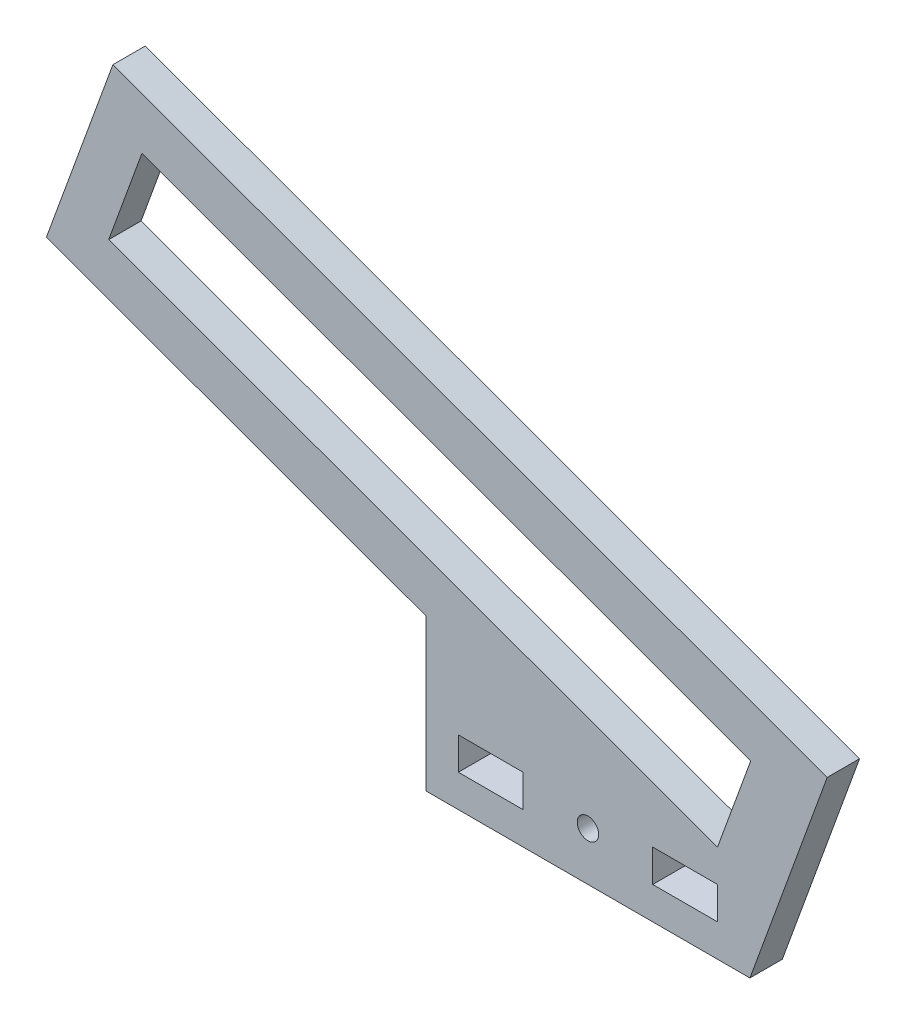
ISO-10303-21;
HEADER;
FILE_DESCRIPTION(('STEP AP214'),'2;1');
FILE_NAME('part.step','',(''),(''),'','','');
FILE_SCHEMA(('AUTOMOTIVE_DESIGN { 1 0 10303 214 1 1 1 1 }'));
ENDSEC;
DATA;
#1=APPLICATION_CONTEXT('core data for automotive mechanical design processes');
#2=APPLICATION_PROTOCOL_DEFINITION('international standard','automotive_design',2000,#1);
#3=PRODUCT_CONTEXT('',#1,'mechanical');
#4=PRODUCT('Part','Part','',(#3));
#5=PRODUCT_RELATED_PRODUCT_CATEGORY('part','',(#4));
#6=PRODUCT_DEFINITION_FORMATION('','',#4);
#7=PRODUCT_DEFINITION_CONTEXT('part definition',#1,'design');
#8=PRODUCT_DEFINITION('design','',#6,#7);
#9=PRODUCT_DEFINITION_SHAPE('','',#8);
#10=(LENGTH_UNIT() NAMED_UNIT(*) SI_UNIT(.MILLI.,.METRE.));
#11=(NAMED_UNIT(*) PLANE_ANGLE_UNIT() SI_UNIT($,.RADIAN.));
#12=(NAMED_UNIT(*) SI_UNIT($,.STERADIAN.) SOLID_ANGLE_UNIT());
#13=UNCERTAINTY_MEASURE_WITH_UNIT(LENGTH_MEASURE(1.E-05),#10,'distance_accuracy_value','');
#14=(GEOMETRIC_REPRESENTATION_CONTEXT(3) GLOBAL_UNCERTAINTY_ASSIGNED_CONTEXT((#13)) GLOBAL_UNIT_ASSIGNED_CONTEXT((#10,
#11,#12)) REPRESENTATION_CONTEXT('',''));
#15=CARTESIAN_POINT('',(0.,0.,0.));
#16=DIRECTION('',(0.,0.,1.));
#17=DIRECTION('',(1.,0.,0.));
#18=AXIS2_PLACEMENT_3D('',#15,#16,#17);
#19=CARTESIAN_POINT('',(-31.75,-9.525,6.35));
#20=DIRECTION('',(1.,0.,0.));
#21=DIRECTION('',(0.,0.,-1.));
#22=AXIS2_PLACEMENT_3D('',#19,#20,#21);
#23=PLANE('',#22);
#24=DIRECTION('',(0.,-1.,0.));
#25=VECTOR('',#24,1.);
#26=CARTESIAN_POINT('',(-31.75,-9.525,0.));
#27=LINE('',#26,#25);
#28=CARTESIAN_POINT('',(-31.75,20.18960560548,0.));
#29=VERTEX_POINT('',#28);
#30=CARTESIAN_POINT('',(-31.75,-9.525,0.));
#31=VERTEX_POINT('',#30);
#32=EDGE_CURVE('E297',#29,#31,#27,.T.);
#33=ORIENTED_EDGE('',*,*,#32,.T.);
#34=DIRECTION('',(0.,0.,-1.));
#35=VECTOR('',#34,1.);
#36=CARTESIAN_POINT('',(-31.75,-9.525,6.35));
#37=LINE('',#36,#35);
#38=CARTESIAN_POINT('',(-31.75,-9.525,6.35));
#39=VERTEX_POINT('',#38);
#40=EDGE_CURVE('E11',#39,#31,#37,.T.);
#41=ORIENTED_EDGE('',*,*,#40,.F.);
#42=DIRECTION('',(0.,-1.,0.));
#43=VECTOR('',#42,1.);
#44=CARTESIAN_POINT('',(-31.75,-9.525,6.35));
#45=LINE('',#44,#43);
#46=CARTESIAN_POINT('',(-31.75,20.18960560548,6.35));
#47=VERTEX_POINT('',#46);
#48=EDGE_CURVE('E300',#47,#39,#45,.T.);
#49=ORIENTED_EDGE('',*,*,#48,.F.);
#50=DIRECTION('',(0.,0.,1.));
#51=VECTOR('',#50,1.);
#52=CARTESIAN_POINT('',(-31.75,20.18960560548,0.));
#53=LINE('',#52,#51);
#54=EDGE_CURVE('E216',#29,#47,#53,.T.);
#55=ORIENTED_EDGE('',*,*,#54,.F.);
#56=EDGE_LOOP('',(#33,#41,#49,#55));
#57=FACE_BOUND('',#56,.T.);
#58=ADVANCED_FACE('F36',(#57),#23,.F.);
#59=CARTESIAN_POINT('',(-31.75,-9.525,6.35));
#60=DIRECTION('',(0.,1.,0.));
#61=DIRECTION('',(0.,0.,1.));
#62=AXIS2_PLACEMENT_3D('',#59,#60,#61);
#63=PLANE('',#62);
#64=DIRECTION('',(1.,0.,0.));
#65=VECTOR('',#64,1.);
#66=CARTESIAN_POINT('',(-31.75,-9.525,0.));
#67=LINE('',#66,#65);
#68=CARTESIAN_POINT('',(31.75,-9.525,0.));
#69=VERTEX_POINT('',#68);
#70=EDGE_CURVE('E303',#31,#69,#67,.T.);
#71=ORIENTED_EDGE('',*,*,#70,.T.);
#72=DIRECTION('',(0.,0.,-1.));
#73=VECTOR('',#72,1.);
#74=CARTESIAN_POINT('',(31.75,-9.525,6.35));
#75=LINE('',#74,#73);
#76=CARTESIAN_POINT('',(31.75,-9.525,6.35));
#77=VERTEX_POINT('',#76);
#78=EDGE_CURVE('E43',#77,#69,#75,.T.);
#79=ORIENTED_EDGE('',*,*,#78,.F.);
#80=DIRECTION('',(1.,0.,0.));
#81=VECTOR('',#80,1.);
#82=CARTESIAN_POINT('',(-31.75,-9.525,6.35));
#83=LINE('',#82,#81);
#84=EDGE_CURVE('E302',#39,#77,#83,.T.);
#85=ORIENTED_EDGE('',*,*,#84,.F.);
#86=ORIENTED_EDGE('',*,*,#40,.T.);
#87=EDGE_LOOP('',(#71,#79,#85,#86));
#88=FACE_BOUND('',#87,.T.);
#89=ADVANCED_FACE('F326',(#88),#63,.F.);
#90=CARTESIAN_POINT('',(0.,0.,6.35));
#91=DIRECTION('',(0.,0.,-1.));
#92=DIRECTION('',(-1.,0.,0.));
#93=AXIS2_PLACEMENT_3D('',#90,#91,#92);
#94=PLANE('',#93);
#95=DIRECTION('',(0.342020143325663,0.939692620785911,0.));
#96=VECTOR('',#95,1.);
#97=CARTESIAN_POINT('',(19.367488436479,-7.0491893033731,6.35));
#98=LINE('',#97,#96);
#99=CARTESIAN_POINT('',(25.4,9.525,6.35));
#100=VERTEX_POINT('',#99);
#101=CARTESIAN_POINT('',(31.9154837303539,27.4261444259716,6.35));
#102=VERTEX_POINT('',#101);
#103=EDGE_CURVE('E197',#100,#102,#98,.T.);
#104=ORIENTED_EDGE('',*,*,#103,.F.);
#105=DIRECTION('',(-0.939692620785911,0.342020143325663,0.));
#106=VECTOR('',#105,1.);
#107=CARTESIAN_POINT('',(6.03251156352098,16.5741893033731,6.35));
#108=LINE('',#107,#106);
#109=CARTESIAN_POINT('',(-93.9409628398106,52.9615582023592,6.35));
#110=VERTEX_POINT('',#109);
#111=EDGE_CURVE('E199',#100,#110,#108,.T.);
#112=ORIENTED_EDGE('',*,*,#111,.T.);
#113=DIRECTION('',(0.342020143325663,0.939692620785911,0.));
#114=VECTOR('',#113,1.);
#115=CARTESIAN_POINT('',(-99.9734744033316,36.387368898986,6.35));
#116=LINE('',#115,#114);
#117=CARTESIAN_POINT('',(-87.4254791094567,70.8627026283308,6.35));
#118=VERTEX_POINT('',#117);
#119=EDGE_CURVE('E166',#110,#118,#116,.T.);
#120=ORIENTED_EDGE('',*,*,#119,.T.);
#121=DIRECTION('',(0.939692620785911,-0.342020143325663,0.));
#122=VECTOR('',#121,1.);
#123=CARTESIAN_POINT('',(12.5479952938749,34.4753337293447,6.35));
#124=LINE('',#123,#122);
#125=EDGE_CURVE('E202',#118,#102,#124,.T.);
#126=ORIENTED_EDGE('',*,*,#125,.T.);
#127=EDGE_LOOP('',(#104,#112,#120,#126));
#128=FACE_BOUND('',#127,.T.);
#129=DIRECTION('',(1.,0.,0.));
#130=VECTOR('',#129,1.);
#131=CARTESIAN_POINT('',(12.7,-3.175,6.35));
#132=LINE('',#131,#130);
#133=CARTESIAN_POINT('',(12.7,-3.175,6.35));
#134=VERTEX_POINT('',#133);
#135=CARTESIAN_POINT('',(25.4,-3.175,6.35));
#136=VERTEX_POINT('',#135);
#137=EDGE_CURVE('E245',#134,#136,#132,.T.);
#138=ORIENTED_EDGE('',*,*,#137,.F.);
#139=DIRECTION('',(0.,-1.,0.));
#140=VECTOR('',#139,1.);
#141=CARTESIAN_POINT('',(12.7,3.175,6.35));
#142=LINE('',#141,#140);
#143=CARTESIAN_POINT('',(12.7,3.175,6.35));
#144=VERTEX_POINT('',#143);
#145=EDGE_CURVE('E219',#144,#134,#142,.T.);
#146=ORIENTED_EDGE('',*,*,#145,.F.);
#147=DIRECTION('',(-1.,0.,0.));
#148=VECTOR('',#147,1.);
#149=CARTESIAN_POINT('',(12.7,3.175,6.35));
#150=LINE('',#149,#148);
#151=CARTESIAN_POINT('',(25.4,3.175,6.35));
#152=VERTEX_POINT('',#151);
#153=EDGE_CURVE('E234',#152,#144,#150,.T.);
#154=ORIENTED_EDGE('',*,*,#153,.F.);
#155=DIRECTION('',(0.,1.,0.));
#156=VECTOR('',#155,1.);
#157=CARTESIAN_POINT('',(25.4,3.175,6.35));
#158=LINE('',#157,#156);
#159=EDGE_CURVE('E248',#136,#152,#158,.T.);
#160=ORIENTED_EDGE('',*,*,#159,.F.);
#161=EDGE_LOOP('',(#138,#146,#154,#160));
#162=FACE_BOUND('',#161,.T.);
#163=DIRECTION('',(1.,0.,0.));
#164=VECTOR('',#163,1.);
#165=CARTESIAN_POINT('',(-25.4,-3.175,6.35));
#166=LINE('',#165,#164);
#167=CARTESIAN_POINT('',(-25.4,-3.175,6.35));
#168=VERTEX_POINT('',#167);
#169=CARTESIAN_POINT('',(-12.7,-3.175,6.35));
#170=VERTEX_POINT('',#169);
#171=EDGE_CURVE('E277',#168,#170,#166,.T.);
#172=ORIENTED_EDGE('',*,*,#171,.F.);
#173=DIRECTION('',(0.,-1.,0.));
#174=VECTOR('',#173,1.);
#175=CARTESIAN_POINT('',(-25.4,3.175,6.35));
#176=LINE('',#175,#174);
#177=CARTESIAN_POINT('',(-25.4,3.175,6.35));
#178=VERTEX_POINT('',#177);
#179=EDGE_CURVE('E255',#178,#168,#176,.T.);
#180=ORIENTED_EDGE('',*,*,#179,.F.);
#181=DIRECTION('',(-1.,0.,0.));
#182=VECTOR('',#181,1.);
#183=CARTESIAN_POINT('',(-25.4,3.175,6.35));
#184=LINE('',#183,#182);
#185=CARTESIAN_POINT('',(-12.7,3.175,6.35));
#186=VERTEX_POINT('',#185);
#187=EDGE_CURVE('E266',#186,#178,#184,.T.);
#188=ORIENTED_EDGE('',*,*,#187,.F.);
#189=DIRECTION('',(0.,1.,0.));
#190=VECTOR('',#189,1.);
#191=CARTESIAN_POINT('',(-12.7,3.175,6.35));
#192=LINE('',#191,#190);
#193=EDGE_CURVE('E280',#170,#186,#192,.T.);
#194=ORIENTED_EDGE('',*,*,#193,.F.);
#195=EDGE_LOOP('',(#172,#180,#188,#194));
#196=FACE_BOUND('',#195,.T.);
#197=CARTESIAN_POINT('',(0.,0.,6.35));
#198=DIRECTION('',(0.,0.,1.));
#199=DIRECTION('',(1.,0.,0.));
#200=AXIS2_PLACEMENT_3D('',#197,#198,#199);
#201=CIRCLE('',#200,2.0955);
#202=CARTESIAN_POINT('',(2.09550000000001,0.,6.35));
#203=VERTEX_POINT('',#202);
#204=EDGE_CURVE('E287',#203,#203,#201,.T.);
#205=ORIENTED_EDGE('',*,*,#204,.F.);
#206=EDGE_LOOP('',(#205));
#207=FACE_BOUND('',#206,.T.);
#208=ORIENTED_EDGE('',*,*,#84,.T.);
#209=DIRECTION('',(0.342020143325663,0.939692620785911,0.));
#210=VECTOR('',#209,1.);
#211=CARTESIAN_POINT('',(31.097231525646,-11.3184666434195,6.35));
#212=LINE('',#211,#210);
#213=CARTESIAN_POINT('',(46.9029686846978,32.107439298911,6.35));
#214=VERTEX_POINT('',#213);
#215=EDGE_CURVE('E205',#77,#214,#212,.T.);
#216=ORIENTED_EDGE('',*,*,#215,.T.);
#217=DIRECTION('',(-0.939692620785911,0.342020143325663,0.));
#218=VECTOR('',#217,1.);
#219=CARTESIAN_POINT('',(15.8057371590518,43.4259059423305,6.35));
#220=LINE('',#219,#218);
#221=CARTESIAN_POINT('',(-93.1183094572656,83.0710167064936,6.35));
#222=VERTEX_POINT('',#221);
#223=EDGE_CURVE('E208',#214,#222,#220,.T.);
#224=ORIENTED_EDGE('',*,*,#223,.T.);
#225=DIRECTION('',(-0.342020143325663,-0.939692620785911,0.));
#226=VECTOR('',#225,1.);
#227=CARTESIAN_POINT('',(-108.924046616317,39.645110764163,6.35));
#228=LINE('',#227,#226);
#229=CARTESIAN_POINT('',(-106.149276917973,47.2687278545503,6.35));
#230=VERTEX_POINT('',#229);
#231=EDGE_CURVE('E211',#222,#230,#228,.T.);
#232=ORIENTED_EDGE('',*,*,#231,.T.);
#233=DIRECTION('',(0.939692620785911,-0.342020143325663,0.));
#234=VECTOR('',#233,1.);
#235=CARTESIAN_POINT('',(2.77476969834404,7.62361709038732,6.35));
#236=LINE('',#235,#234);
#237=EDGE_CURVE('E181',#230,#47,#236,.T.);
#238=ORIENTED_EDGE('',*,*,#237,.T.);
#239=ORIENTED_EDGE('',*,*,#48,.T.);
#240=EDGE_LOOP('',(#208,#216,#224,#232,#238,#239));
#241=FACE_BOUND('',#240,.T.);
#242=ADVANCED_FACE('F324',(#128,#162,#196,#207,#241),#94,.F.);
#243=CARTESIAN_POINT('',(0.,0.,0.));
#244=DIRECTION('',(0.,0.,-1.));
#245=DIRECTION('',(-1.,0.,0.));
#246=AXIS2_PLACEMENT_3D('',#243,#244,#245);
#247=PLANE('',#246);
#248=DIRECTION('',(-0.939692620785911,0.342020143325663,0.));
#249=VECTOR('',#248,1.);
#250=CARTESIAN_POINT('',(6.03251156352098,16.5741893033731,0.));
#251=LINE('',#250,#249);
#252=CARTESIAN_POINT('',(25.4,9.525,0.));
#253=VERTEX_POINT('',#252);
#254=CARTESIAN_POINT('',(-93.9409628398106,52.9615582023592,0.));
#255=VERTEX_POINT('',#254);
#256=EDGE_CURVE('E174',#253,#255,#251,.T.);
#257=ORIENTED_EDGE('',*,*,#256,.F.);
#258=DIRECTION('',(0.342020143325663,0.939692620785911,0.));
#259=VECTOR('',#258,1.);
#260=CARTESIAN_POINT('',(19.367488436479,-7.0491893033731,0.));
#261=LINE('',#260,#259);
#262=CARTESIAN_POINT('',(31.9154837303539,27.4261444259716,0.));
#263=VERTEX_POINT('',#262);
#264=EDGE_CURVE('E179',#253,#263,#261,.T.);
#265=ORIENTED_EDGE('',*,*,#264,.T.);
#266=DIRECTION('',(0.939692620785911,-0.342020143325663,0.));
#267=VECTOR('',#266,1.);
#268=CARTESIAN_POINT('',(12.5479952938749,34.4753337293447,0.));
#269=LINE('',#268,#267);
#270=CARTESIAN_POINT('',(-87.4254791094567,70.8627026283308,0.));
#271=VERTEX_POINT('',#270);
#272=EDGE_CURVE('E176',#271,#263,#269,.T.);
#273=ORIENTED_EDGE('',*,*,#272,.F.);
#274=DIRECTION('',(0.342020143325663,0.939692620785911,0.));
#275=VECTOR('',#274,1.);
#276=CARTESIAN_POINT('',(-99.9734744033316,36.387368898986,0.));
#277=LINE('',#276,#275);
#278=EDGE_CURVE('E163',#255,#271,#277,.T.);
#279=ORIENTED_EDGE('',*,*,#278,.F.);
#280=EDGE_LOOP('',(#257,#265,#273,#279));
#281=FACE_BOUND('',#280,.T.);
#282=DIRECTION('',(0.,-1.,0.));
#283=VECTOR('',#282,1.);
#284=CARTESIAN_POINT('',(12.7,3.175,0.));
#285=LINE('',#284,#283);
#286=CARTESIAN_POINT('',(12.7,3.175,0.));
#287=VERTEX_POINT('',#286);
#288=CARTESIAN_POINT('',(12.7,-3.175,0.));
#289=VERTEX_POINT('',#288);
#290=EDGE_CURVE('E230',#287,#289,#285,.T.);
#291=ORIENTED_EDGE('',*,*,#290,.T.);
#292=DIRECTION('',(1.,0.,0.));
#293=VECTOR('',#292,1.);
#294=CARTESIAN_POINT('',(12.7,-3.175,0.));
#295=LINE('',#294,#293);
#296=CARTESIAN_POINT('',(25.4,-3.175,0.));
#297=VERTEX_POINT('',#296);
#298=EDGE_CURVE('E233',#289,#297,#295,.T.);
#299=ORIENTED_EDGE('',*,*,#298,.T.);
#300=DIRECTION('',(0.,1.,0.));
#301=VECTOR('',#300,1.);
#302=CARTESIAN_POINT('',(25.4,3.175,0.));
#303=LINE('',#302,#301);
#304=CARTESIAN_POINT('',(25.4,3.175,0.));
#305=VERTEX_POINT('',#304);
#306=EDGE_CURVE('E237',#297,#305,#303,.T.);
#307=ORIENTED_EDGE('',*,*,#306,.T.);
#308=DIRECTION('',(-1.,0.,0.));
#309=VECTOR('',#308,1.);
#310=CARTESIAN_POINT('',(12.7,3.175,0.));
#311=LINE('',#310,#309);
#312=EDGE_CURVE('E240',#305,#287,#311,.T.);
#313=ORIENTED_EDGE('',*,*,#312,.T.);
#314=EDGE_LOOP('',(#291,#299,#307,#313));
#315=FACE_BOUND('',#314,.T.);
#316=DIRECTION('',(0.,-1.,0.));
#317=VECTOR('',#316,1.);
#318=CARTESIAN_POINT('',(-25.4,3.175,0.));
#319=LINE('',#318,#317);
#320=CARTESIAN_POINT('',(-25.4,3.175,0.));
#321=VERTEX_POINT('',#320);
#322=CARTESIAN_POINT('',(-25.4,-3.175,0.));
#323=VERTEX_POINT('',#322);
#324=EDGE_CURVE('E262',#321,#323,#319,.T.);
#325=ORIENTED_EDGE('',*,*,#324,.T.);
#326=DIRECTION('',(1.,0.,0.));
#327=VECTOR('',#326,1.);
#328=CARTESIAN_POINT('',(-25.4,-3.175,0.));
#329=LINE('',#328,#327);
#330=CARTESIAN_POINT('',(-12.7,-3.175,0.));
#331=VERTEX_POINT('',#330);
#332=EDGE_CURVE('E265',#323,#331,#329,.T.);
#333=ORIENTED_EDGE('',*,*,#332,.T.);
#334=DIRECTION('',(0.,1.,0.));
#335=VECTOR('',#334,1.);
#336=CARTESIAN_POINT('',(-12.7,3.175,0.));
#337=LINE('',#336,#335);
#338=CARTESIAN_POINT('',(-12.7,3.175,0.));
#339=VERTEX_POINT('',#338);
#340=EDGE_CURVE('E269',#331,#339,#337,.T.);
#341=ORIENTED_EDGE('',*,*,#340,.T.);
#342=DIRECTION('',(-1.,0.,0.));
#343=VECTOR('',#342,1.);
#344=CARTESIAN_POINT('',(-25.4,3.175,0.));
#345=LINE('',#344,#343);
#346=EDGE_CURVE('E272',#339,#321,#345,.T.);
#347=ORIENTED_EDGE('',*,*,#346,.T.);
#348=EDGE_LOOP('',(#325,#333,#341,#347));
#349=FACE_BOUND('',#348,.T.);
#350=CARTESIAN_POINT('',(0.,0.,0.));
#351=DIRECTION('',(0.,0.,1.));
#352=DIRECTION('',(1.,0.,0.));
#353=AXIS2_PLACEMENT_3D('',#350,#351,#352);
#354=CIRCLE('',#353,2.0955);
#355=CARTESIAN_POINT('',(2.09550000000001,0.,0.));
#356=VERTEX_POINT('',#355);
#357=EDGE_CURVE('E294',#356,#356,#354,.T.);
#358=ORIENTED_EDGE('',*,*,#357,.T.);
#359=EDGE_LOOP('',(#358));
#360=FACE_BOUND('',#359,.T.);
#361=DIRECTION('',(0.342020143325663,0.939692620785911,0.));
#362=VECTOR('',#361,1.);
#363=CARTESIAN_POINT('',(31.097231525646,-11.3184666434195,0.));
#364=LINE('',#363,#362);
#365=CARTESIAN_POINT('',(46.9029686846978,32.107439298911,0.));
#366=VERTEX_POINT('',#365);
#367=EDGE_CURVE('E185',#69,#366,#364,.T.);
#368=ORIENTED_EDGE('',*,*,#367,.F.);
#369=ORIENTED_EDGE('',*,*,#70,.F.);
#370=ORIENTED_EDGE('',*,*,#32,.F.);
#371=DIRECTION('',(0.939692620785911,-0.342020143325663,0.));
#372=VECTOR('',#371,1.);
#373=CARTESIAN_POINT('',(2.77476969834404,7.62361709038732,0.));
#374=LINE('',#373,#372);
#375=CARTESIAN_POINT('',(-106.149276917973,47.2687278545503,0.));
#376=VERTEX_POINT('',#375);
#377=EDGE_CURVE('E194',#376,#29,#374,.T.);
#378=ORIENTED_EDGE('',*,*,#377,.F.);
#379=DIRECTION('',(-0.342020143325663,-0.939692620785911,0.));
#380=VECTOR('',#379,1.);
#381=CARTESIAN_POINT('',(-108.924046616317,39.645110764163,0.));
#382=LINE('',#381,#380);
#383=CARTESIAN_POINT('',(-93.1183094572656,83.0710167064936,0.));
#384=VERTEX_POINT('',#383);
#385=EDGE_CURVE('E191',#384,#376,#382,.T.);
#386=ORIENTED_EDGE('',*,*,#385,.F.);
#387=DIRECTION('',(-0.939692620785911,0.342020143325663,0.));
#388=VECTOR('',#387,1.);
#389=CARTESIAN_POINT('',(15.8057371590518,43.4259059423305,0.));
#390=LINE('',#389,#388);
#391=EDGE_CURVE('E188',#366,#384,#390,.T.);
#392=ORIENTED_EDGE('',*,*,#391,.F.);
#393=EDGE_LOOP('',(#368,#369,#370,#378,#386,#392));
#394=FACE_BOUND('',#393,.T.);
#395=ADVANCED_FACE('F172',(#281,#315,#349,#360,#394),#247,.T.);
#396=CARTESIAN_POINT('',(0.,0.,0.));
#397=DIRECTION('',(0.,0.,1.));
#398=DIRECTION('',(1.,0.,0.));
#399=AXIS2_PLACEMENT_3D('',#396,#397,#398);
#400=CYLINDRICAL_SURFACE('',#399,2.0955);
#401=ORIENTED_EDGE('',*,*,#357,.F.);
#402=EDGE_LOOP('',(#401));
#403=FACE_BOUND('',#402,.T.);
#404=ORIENTED_EDGE('',*,*,#204,.T.);
#405=EDGE_LOOP('',(#404));
#406=FACE_BOUND('',#405,.T.);
#407=ADVANCED_FACE('F356',(#403,#406),#400,.F.);
#408=CARTESIAN_POINT('',(-25.4,3.175,0.));
#409=DIRECTION('',(-1.,0.,0.));
#410=DIRECTION('',(0.,0.,1.));
#411=AXIS2_PLACEMENT_3D('',#408,#409,#410);
#412=PLANE('',#411);
#413=ORIENTED_EDGE('',*,*,#179,.T.);
#414=DIRECTION('',(0.,0.,1.));
#415=VECTOR('',#414,1.);
#416=CARTESIAN_POINT('',(-25.4,-3.175,0.));
#417=LINE('',#416,#415);
#418=EDGE_CURVE('E275',#323,#168,#417,.T.);
#419=ORIENTED_EDGE('',*,*,#418,.F.);
#420=ORIENTED_EDGE('',*,*,#324,.F.);
#421=DIRECTION('',(0.,0.,1.));
#422=VECTOR('',#421,1.);
#423=CARTESIAN_POINT('',(-25.4,3.175,0.));
#424=LINE('',#423,#422);
#425=EDGE_CURVE('E285',#321,#178,#424,.T.);
#426=ORIENTED_EDGE('',*,*,#425,.T.);
#427=EDGE_LOOP('',(#413,#419,#420,#426));
#428=FACE_BOUND('',#427,.T.);
#429=ADVANCED_FACE('F360',(#428),#412,.F.);
#430=CARTESIAN_POINT('',(-25.4,3.175,0.));
#431=DIRECTION('',(0.,1.,0.));
#432=DIRECTION('',(0.,0.,1.));
#433=AXIS2_PLACEMENT_3D('',#430,#431,#432);
#434=PLANE('',#433);
#435=ORIENTED_EDGE('',*,*,#187,.T.);
#436=ORIENTED_EDGE('',*,*,#425,.F.);
#437=ORIENTED_EDGE('',*,*,#346,.F.);
#438=DIRECTION('',(0.,0.,1.));
#439=VECTOR('',#438,1.);
#440=CARTESIAN_POINT('',(-12.7,3.175,0.));
#441=LINE('',#440,#439);
#442=EDGE_CURVE('E288',#339,#186,#441,.T.);
#443=ORIENTED_EDGE('',*,*,#442,.T.);
#444=EDGE_LOOP('',(#435,#436,#437,#443));
#445=FACE_BOUND('',#444,.T.);
#446=ADVANCED_FACE('F364',(#445),#434,.F.);
#447=CARTESIAN_POINT('',(-12.7,3.175,0.));
#448=DIRECTION('',(1.,0.,0.));
#449=DIRECTION('',(0.,1.,0.));
#450=AXIS2_PLACEMENT_3D('',#447,#448,#449);
#451=PLANE('',#450);
#452=ORIENTED_EDGE('',*,*,#193,.T.);
#453=ORIENTED_EDGE('',*,*,#442,.F.);
#454=ORIENTED_EDGE('',*,*,#340,.F.);
#455=DIRECTION('',(0.,0.,1.));
#456=VECTOR('',#455,1.);
#457=CARTESIAN_POINT('',(-12.7,-3.175,0.));
#458=LINE('',#457,#456);
#459=EDGE_CURVE('E290',#331,#170,#458,.T.);
#460=ORIENTED_EDGE('',*,*,#459,.T.);
#461=EDGE_LOOP('',(#452,#453,#454,#460));
#462=FACE_BOUND('',#461,.T.);
#463=ADVANCED_FACE('F370',(#462),#451,.F.);
#464=CARTESIAN_POINT('',(-25.4,-3.175,0.));
#465=DIRECTION('',(0.,-1.,0.));
#466=DIRECTION('',(0.,0.,-1.));
#467=AXIS2_PLACEMENT_3D('',#464,#465,#466);
#468=PLANE('',#467);
#469=ORIENTED_EDGE('',*,*,#171,.T.);
#470=ORIENTED_EDGE('',*,*,#459,.F.);
#471=ORIENTED_EDGE('',*,*,#332,.F.);
#472=ORIENTED_EDGE('',*,*,#418,.T.);
#473=EDGE_LOOP('',(#469,#470,#471,#472));
#474=FACE_BOUND('',#473,.T.);
#475=ADVANCED_FACE('F366',(#474),#468,.F.);
#476=CARTESIAN_POINT('',(12.7,3.175,0.));
#477=DIRECTION('',(-1.,0.,0.));
#478=DIRECTION('',(0.,-1.,0.));
#479=AXIS2_PLACEMENT_3D('',#476,#477,#478);
#480=PLANE('',#479);
#481=ORIENTED_EDGE('',*,*,#145,.T.);
#482=DIRECTION('',(0.,0.,1.));
#483=VECTOR('',#482,1.);
#484=CARTESIAN_POINT('',(12.7,-3.175,0.));
#485=LINE('',#484,#483);
#486=EDGE_CURVE('E243',#289,#134,#485,.T.);
#487=ORIENTED_EDGE('',*,*,#486,.F.);
#488=ORIENTED_EDGE('',*,*,#290,.F.);
#489=DIRECTION('',(0.,0.,1.));
#490=VECTOR('',#489,1.);
#491=CARTESIAN_POINT('',(12.7,3.175,0.));
#492=LINE('',#491,#490);
#493=EDGE_CURVE('E253',#287,#144,#492,.T.);
#494=ORIENTED_EDGE('',*,*,#493,.T.);
#495=EDGE_LOOP('',(#481,#487,#488,#494));
#496=FACE_BOUND('',#495,.T.);
#497=ADVANCED_FACE('F369',(#496),#480,.F.);
#498=CARTESIAN_POINT('',(12.7,3.175,0.));
#499=DIRECTION('',(0.,1.,0.));
#500=DIRECTION('',(0.,0.,1.));
#501=AXIS2_PLACEMENT_3D('',#498,#499,#500);
#502=PLANE('',#501);
#503=ORIENTED_EDGE('',*,*,#153,.T.);
#504=ORIENTED_EDGE('',*,*,#493,.F.);
#505=ORIENTED_EDGE('',*,*,#312,.F.);
#506=DIRECTION('',(0.,0.,1.));
#507=VECTOR('',#506,1.);
#508=CARTESIAN_POINT('',(25.4,3.175,0.));
#509=LINE('',#508,#507);
#510=EDGE_CURVE('E256',#305,#152,#509,.T.);
#511=ORIENTED_EDGE('',*,*,#510,.T.);
#512=EDGE_LOOP('',(#503,#504,#505,#511));
#513=FACE_BOUND('',#512,.T.);
#514=ADVANCED_FACE('F379',(#513),#502,.F.);
#515=CARTESIAN_POINT('',(25.4,3.175,0.));
#516=DIRECTION('',(1.,0.,0.));
#517=DIRECTION('',(0.,1.,0.));
#518=AXIS2_PLACEMENT_3D('',#515,#516,#517);
#519=PLANE('',#518);
#520=ORIENTED_EDGE('',*,*,#159,.T.);
#521=ORIENTED_EDGE('',*,*,#510,.F.);
#522=ORIENTED_EDGE('',*,*,#306,.F.);
#523=DIRECTION('',(0.,0.,1.));
#524=VECTOR('',#523,1.);
#525=CARTESIAN_POINT('',(25.4,-3.175,0.));
#526=LINE('',#525,#524);
#527=EDGE_CURVE('E258',#297,#136,#526,.T.);
#528=ORIENTED_EDGE('',*,*,#527,.T.);
#529=EDGE_LOOP('',(#520,#521,#522,#528));
#530=FACE_BOUND('',#529,.T.);
#531=ADVANCED_FACE('F342',(#530),#519,.F.);
#532=CARTESIAN_POINT('',(12.7,-3.175,0.));
#533=DIRECTION('',(0.,-1.,0.));
#534=DIRECTION('',(0.,0.,-1.));
#535=AXIS2_PLACEMENT_3D('',#532,#533,#534);
#536=PLANE('',#535);
#537=ORIENTED_EDGE('',*,*,#137,.T.);
#538=ORIENTED_EDGE('',*,*,#527,.F.);
#539=ORIENTED_EDGE('',*,*,#298,.F.);
#540=ORIENTED_EDGE('',*,*,#486,.T.);
#541=EDGE_LOOP('',(#537,#538,#539,#540));
#542=FACE_BOUND('',#541,.T.);
#543=ADVANCED_FACE('F335',(#542),#536,.F.);
#544=CARTESIAN_POINT('',(2.77476969834404,7.62361709038732,0.));
#545=DIRECTION('',(-0.342020143325663,-0.93969262078591,0.));
#546=DIRECTION('',(0.939692620785911,-0.342020143325663,0.));
#547=AXIS2_PLACEMENT_3D('',#544,#545,#546);
#548=PLANE('',#547);
#549=ORIENTED_EDGE('',*,*,#237,.F.);
#550=DIRECTION('',(0.,0.,1.));
#551=VECTOR('',#550,1.);
#552=CARTESIAN_POINT('',(-106.149276917973,47.2687278545503,0.));
#553=LINE('',#552,#551);
#554=EDGE_CURVE('E220',#376,#230,#553,.T.);
#555=ORIENTED_EDGE('',*,*,#554,.F.);
#556=ORIENTED_EDGE('',*,*,#377,.T.);
#557=ORIENTED_EDGE('',*,*,#54,.T.);
#558=EDGE_LOOP('',(#549,#555,#556,#557));
#559=FACE_BOUND('',#558,.T.);
#560=ADVANCED_FACE('F333',(#559),#548,.T.);
#561=CARTESIAN_POINT('',(-108.924046616317,39.645110764163,0.));
#562=DIRECTION('',(-0.939692620785911,0.342020143325663,0.));
#563=DIRECTION('',(-0.342020143325663,-0.939692620785911,0.));
#564=AXIS2_PLACEMENT_3D('',#561,#562,#563);
#565=PLANE('',#564);
#566=ORIENTED_EDGE('',*,*,#231,.F.);
#567=DIRECTION('',(0.,0.,1.));
#568=VECTOR('',#567,1.);
#569=CARTESIAN_POINT('',(-93.1183094572656,83.0710167064936,0.));
#570=LINE('',#569,#568);
#571=EDGE_CURVE('E222',#384,#222,#570,.T.);
#572=ORIENTED_EDGE('',*,*,#571,.F.);
#573=ORIENTED_EDGE('',*,*,#385,.T.);
#574=ORIENTED_EDGE('',*,*,#554,.T.);
#575=EDGE_LOOP('',(#566,#572,#573,#574));
#576=FACE_BOUND('',#575,.T.);
#577=ADVANCED_FACE('F331',(#576),#565,.T.);
#578=CARTESIAN_POINT('',(15.8057371590518,43.4259059423305,0.));
#579=DIRECTION('',(0.342020143325663,0.93969262078591,0.));
#580=DIRECTION('',(-0.939692620785911,0.342020143325663,0.));
#581=AXIS2_PLACEMENT_3D('',#578,#579,#580);
#582=PLANE('',#581);
#583=ORIENTED_EDGE('',*,*,#223,.F.);
#584=DIRECTION('',(0.,0.,1.));
#585=VECTOR('',#584,1.);
#586=CARTESIAN_POINT('',(46.9029686846978,32.107439298911,0.));
#587=LINE('',#586,#585);
#588=EDGE_CURVE('E224',#366,#214,#587,.T.);
#589=ORIENTED_EDGE('',*,*,#588,.F.);
#590=ORIENTED_EDGE('',*,*,#391,.T.);
#591=ORIENTED_EDGE('',*,*,#571,.T.);
#592=EDGE_LOOP('',(#583,#589,#590,#591));
#593=FACE_BOUND('',#592,.T.);
#594=ADVANCED_FACE('F321',(#593),#582,.T.);
#595=CARTESIAN_POINT('',(19.367488436479,-7.0491893033731,0.));
#596=DIRECTION('',(0.93969262078591,-0.342020143325663,0.));
#597=DIRECTION('',(0.342020143325663,0.939692620785911,0.));
#598=AXIS2_PLACEMENT_3D('',#595,#596,#597);
#599=PLANE('',#598);
#600=ORIENTED_EDGE('',*,*,#103,.T.);
#601=DIRECTION('',(0.,0.,1.));
#602=VECTOR('',#601,1.);
#603=CARTESIAN_POINT('',(31.9154837303539,27.4261444259716,0.));
#604=LINE('',#603,#602);
#605=EDGE_CURVE('E226',#263,#102,#604,.T.);
#606=ORIENTED_EDGE('',*,*,#605,.F.);
#607=ORIENTED_EDGE('',*,*,#264,.F.);
#608=DIRECTION('',(0.,0.,1.));
#609=VECTOR('',#608,1.);
#610=CARTESIAN_POINT('',(25.4,9.525,0.));
#611=LINE('',#610,#609);
#612=EDGE_CURVE('E50',#253,#100,#611,.T.);
#613=ORIENTED_EDGE('',*,*,#612,.T.);
#614=EDGE_LOOP('',(#600,#606,#607,#613));
#615=FACE_BOUND('',#614,.T.);
#616=ADVANCED_FACE('F388',(#615),#599,.F.);
#617=CARTESIAN_POINT('',(12.5479952938749,34.4753337293447,0.));
#618=DIRECTION('',(-0.342020143325663,-0.93969262078591,0.));
#619=DIRECTION('',(0.939692620785911,-0.342020143325663,0.));
#620=AXIS2_PLACEMENT_3D('',#617,#618,#619);
#621=PLANE('',#620);
#622=ORIENTED_EDGE('',*,*,#125,.F.);
#623=DIRECTION('',(0.,0.,1.));
#624=VECTOR('',#623,1.);
#625=CARTESIAN_POINT('',(-87.4254791094567,70.8627026283308,0.));
#626=LINE('',#625,#624);
#627=EDGE_CURVE('E168',#271,#118,#626,.T.);
#628=ORIENTED_EDGE('',*,*,#627,.F.);
#629=ORIENTED_EDGE('',*,*,#272,.T.);
#630=ORIENTED_EDGE('',*,*,#605,.T.);
#631=EDGE_LOOP('',(#622,#628,#629,#630));
#632=FACE_BOUND('',#631,.T.);
#633=ADVANCED_FACE('F391',(#632),#621,.T.);
#634=CARTESIAN_POINT('',(-99.9734744033316,36.387368898986,0.));
#635=DIRECTION('',(0.939692620785911,-0.342020143325663,0.));
#636=DIRECTION('',(0.342020143325663,0.939692620785911,0.));
#637=AXIS2_PLACEMENT_3D('',#634,#635,#636);
#638=PLANE('',#637);
#639=ORIENTED_EDGE('',*,*,#119,.F.);
#640=DIRECTION('',(0.,0.,1.));
#641=VECTOR('',#640,1.);
#642=CARTESIAN_POINT('',(-93.9409628398106,52.9615582023592,0.));
#643=LINE('',#642,#641);
#644=EDGE_CURVE('E160',#255,#110,#643,.T.);
#645=ORIENTED_EDGE('',*,*,#644,.F.);
#646=ORIENTED_EDGE('',*,*,#278,.T.);
#647=ORIENTED_EDGE('',*,*,#627,.T.);
#648=EDGE_LOOP('',(#639,#645,#646,#647));
#649=FACE_BOUND('',#648,.T.);
#650=ADVANCED_FACE('F162',(#649),#638,.T.);
#651=CARTESIAN_POINT('',(31.097231525646,-11.3184666434195,0.));
#652=DIRECTION('',(0.939692620785911,-0.342020143325663,0.));
#653=DIRECTION('',(0.342020143325663,0.939692620785911,0.));
#654=AXIS2_PLACEMENT_3D('',#651,#652,#653);
#655=PLANE('',#654);
#656=ORIENTED_EDGE('',*,*,#215,.F.);
#657=ORIENTED_EDGE('',*,*,#78,.T.);
#658=ORIENTED_EDGE('',*,*,#367,.T.);
#659=ORIENTED_EDGE('',*,*,#588,.T.);
#660=EDGE_LOOP('',(#656,#657,#658,#659));
#661=FACE_BOUND('',#660,.T.);
#662=ADVANCED_FACE('F311',(#661),#655,.T.);
#663=CARTESIAN_POINT('',(6.03251156352098,16.5741893033731,0.));
#664=DIRECTION('',(0.342020143325663,0.93969262078591,0.));
#665=DIRECTION('',(-0.939692620785911,0.342020143325663,0.));
#666=AXIS2_PLACEMENT_3D('',#663,#664,#665);
#667=PLANE('',#666);
#668=ORIENTED_EDGE('',*,*,#111,.F.);
#669=ORIENTED_EDGE('',*,*,#612,.F.);
#670=ORIENTED_EDGE('',*,*,#256,.T.);
#671=ORIENTED_EDGE('',*,*,#644,.T.);
#672=EDGE_LOOP('',(#668,#669,#670,#671));
#673=FACE_BOUND('',#672,.T.);
#674=ADVANCED_FACE('F178',(#673),#667,.T.);
#675=CLOSED_SHELL('',(#58,#89,#242,#395,#407,#429,#446,#463,#475,#497,#514,#531,#543,#560,#577,
#594,#616,#633,#650,#662,#674));
#676=MANIFOLD_SOLID_BREP('B2',#675);
#677=ADVANCED_BREP_SHAPE_REPRESENTATION('',(#18,#676),#14);
#678=SHAPE_DEFINITION_REPRESENTATION(#9,#677);
ENDSEC;
END-ISO-10303-21;
